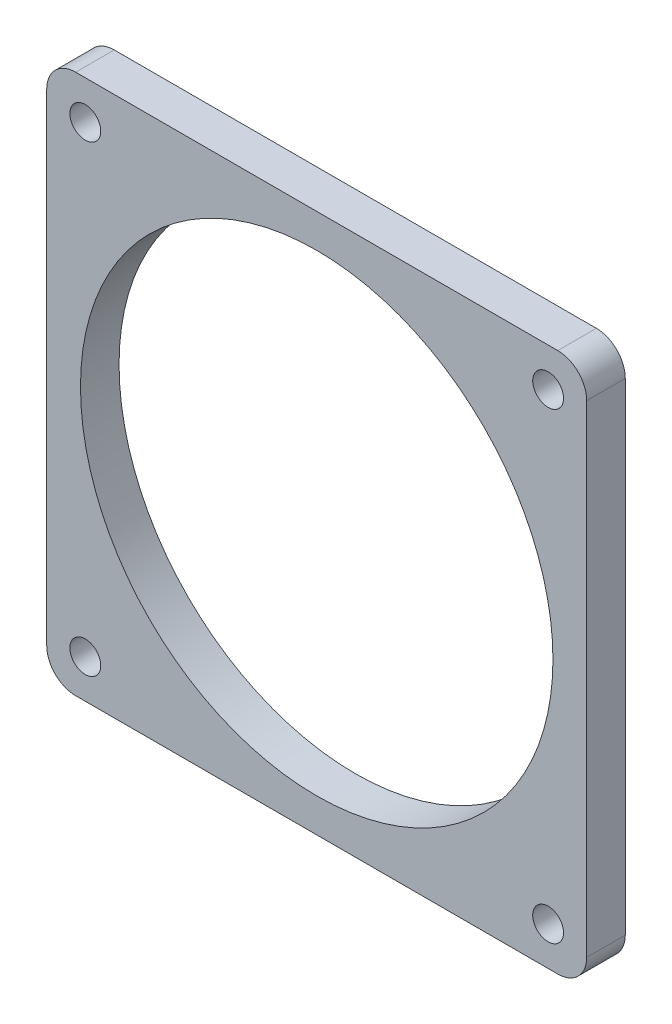
ISO-10303-21;
HEADER;
FILE_DESCRIPTION(('STEP AP214'),'2;1');
FILE_NAME('part.step','',(''),(''),'','','');
FILE_SCHEMA(('AUTOMOTIVE_DESIGN { 1 0 10303 214 1 1 1 1 }'));
ENDSEC;
DATA;
#1=APPLICATION_CONTEXT('core data for automotive mechanical design processes');
#2=APPLICATION_PROTOCOL_DEFINITION('international standard','automotive_design',2000,#1);
#3=PRODUCT_CONTEXT('',#1,'mechanical');
#4=PRODUCT('Part','Part','',(#3));
#5=PRODUCT_RELATED_PRODUCT_CATEGORY('part','',(#4));
#6=PRODUCT_DEFINITION_FORMATION('','',#4);
#7=PRODUCT_DEFINITION_CONTEXT('part definition',#1,'design');
#8=PRODUCT_DEFINITION('design','',#6,#7);
#9=PRODUCT_DEFINITION_SHAPE('','',#8);
#10=(LENGTH_UNIT() NAMED_UNIT(*) SI_UNIT(.MILLI.,.METRE.));
#11=(NAMED_UNIT(*) PLANE_ANGLE_UNIT() SI_UNIT($,.RADIAN.));
#12=(NAMED_UNIT(*) SI_UNIT($,.STERADIAN.) SOLID_ANGLE_UNIT());
#13=UNCERTAINTY_MEASURE_WITH_UNIT(LENGTH_MEASURE(1.E-05),#10,'distance_accuracy_value','');
#14=(GEOMETRIC_REPRESENTATION_CONTEXT(3) GLOBAL_UNCERTAINTY_ASSIGNED_CONTEXT((#13)) GLOBAL_UNIT_ASSIGNED_CONTEXT((#10,
#11,#12)) REPRESENTATION_CONTEXT('',''));
#15=CARTESIAN_POINT('',(0.,0.,0.));
#16=DIRECTION('',(0.,0.,1.));
#17=DIRECTION('',(1.,0.,0.));
#18=AXIS2_PLACEMENT_3D('',#15,#16,#17);
#19=CARTESIAN_POINT('',(28.,28.,-4.));
#20=DIRECTION('',(1.,0.,0.));
#21=DIRECTION('',(0.,1.,0.));
#22=AXIS2_PLACEMENT_3D('',#19,#20,#21);
#23=PLANE('',#22);
#24=DIRECTION('',(0.,1.,0.));
#25=VECTOR('',#24,1.);
#26=CARTESIAN_POINT('',(28.,28.,-4.));
#27=LINE('',#26,#25);
#28=CARTESIAN_POINT('',(28.,-25.,-4.));
#29=VERTEX_POINT('',#28);
#30=CARTESIAN_POINT('',(28.,25.,-4.));
#31=VERTEX_POINT('',#30);
#32=EDGE_CURVE('E163',#29,#31,#27,.T.);
#33=ORIENTED_EDGE('',*,*,#32,.T.);
#34=DIRECTION('',(0.,0.,1.));
#35=VECTOR('',#34,1.);
#36=CARTESIAN_POINT('',(28.,25.,-4.));
#37=LINE('',#36,#35);
#38=CARTESIAN_POINT('',(28.,25.,0.));
#39=VERTEX_POINT('',#38);
#40=EDGE_CURVE('E11',#31,#39,#37,.T.);
#41=ORIENTED_EDGE('',*,*,#40,.T.);
#42=DIRECTION('',(0.,1.,0.));
#43=VECTOR('',#42,1.);
#44=CARTESIAN_POINT('',(28.,28.,0.));
#45=LINE('',#44,#43);
#46=CARTESIAN_POINT('',(28.,-25.,0.));
#47=VERTEX_POINT('',#46);
#48=EDGE_CURVE('E113',#47,#39,#45,.T.);
#49=ORIENTED_EDGE('',*,*,#48,.F.);
#50=DIRECTION('',(0.,0.,1.));
#51=VECTOR('',#50,1.);
#52=CARTESIAN_POINT('',(28.,-25.,-4.));
#53=LINE('',#52,#51);
#54=EDGE_CURVE('E49',#47,#29,#53,.F.);
#55=ORIENTED_EDGE('',*,*,#54,.T.);
#56=EDGE_LOOP('',(#33,#41,#49,#55));
#57=FACE_BOUND('',#56,.T.);
#58=ADVANCED_FACE('F41',(#57),#23,.T.);
#59=CARTESIAN_POINT('',(-28.,-28.,-4.));
#60=DIRECTION('',(0.,-1.,0.));
#61=DIRECTION('',(0.,0.,-1.));
#62=AXIS2_PLACEMENT_3D('',#59,#60,#61);
#63=PLANE('',#62);
#64=DIRECTION('',(1.,0.,0.));
#65=VECTOR('',#64,1.);
#66=CARTESIAN_POINT('',(-28.,-28.,0.));
#67=LINE('',#66,#65);
#68=CARTESIAN_POINT('',(-25.,-28.,0.));
#69=VERTEX_POINT('',#68);
#70=CARTESIAN_POINT('',(25.,-28.,0.));
#71=VERTEX_POINT('',#70);
#72=EDGE_CURVE('E139',#69,#71,#67,.T.);
#73=ORIENTED_EDGE('',*,*,#72,.F.);
#74=DIRECTION('',(0.,0.,1.));
#75=VECTOR('',#74,1.);
#76=CARTESIAN_POINT('',(-25.,-28.,-4.));
#77=LINE('',#76,#75);
#78=CARTESIAN_POINT('',(-25.,-28.,-4.));
#79=VERTEX_POINT('',#78);
#80=EDGE_CURVE('E63',#69,#79,#77,.F.);
#81=ORIENTED_EDGE('',*,*,#80,.T.);
#82=DIRECTION('',(1.,0.,0.));
#83=VECTOR('',#82,1.);
#84=CARTESIAN_POINT('',(-28.,-28.,-4.));
#85=LINE('',#84,#83);
#86=CARTESIAN_POINT('',(25.,-28.,-4.));
#87=VERTEX_POINT('',#86);
#88=EDGE_CURVE('E133',#79,#87,#85,.T.);
#89=ORIENTED_EDGE('',*,*,#88,.T.);
#90=DIRECTION('',(0.,0.,1.));
#91=VECTOR('',#90,1.);
#92=CARTESIAN_POINT('',(25.,-28.,-4.));
#93=LINE('',#92,#91);
#94=EDGE_CURVE('E157',#87,#71,#93,.T.);
#95=ORIENTED_EDGE('',*,*,#94,.T.);
#96=EDGE_LOOP('',(#73,#81,#89,#95));
#97=FACE_BOUND('',#96,.T.);
#98=ADVANCED_FACE('F171',(#97),#63,.T.);
#99=CARTESIAN_POINT('',(-28.,28.,-4.));
#100=DIRECTION('',(-1.,0.,0.));
#101=DIRECTION('',(0.,-1.,0.));
#102=AXIS2_PLACEMENT_3D('',#99,#100,#101);
#103=PLANE('',#102);
#104=DIRECTION('',(0.,-1.,0.));
#105=VECTOR('',#104,1.);
#106=CARTESIAN_POINT('',(-28.,28.,0.));
#107=LINE('',#106,#105);
#108=CARTESIAN_POINT('',(-28.,25.,0.));
#109=VERTEX_POINT('',#108);
#110=CARTESIAN_POINT('',(-28.,-25.,0.));
#111=VERTEX_POINT('',#110);
#112=EDGE_CURVE('E128',#109,#111,#107,.T.);
#113=ORIENTED_EDGE('',*,*,#112,.F.);
#114=DIRECTION('',(0.,0.,1.));
#115=VECTOR('',#114,1.);
#116=CARTESIAN_POINT('',(-28.,25.,-4.));
#117=LINE('',#116,#115);
#118=CARTESIAN_POINT('',(-28.,25.,-4.));
#119=VERTEX_POINT('',#118);
#120=EDGE_CURVE('E149',#109,#119,#117,.F.);
#121=ORIENTED_EDGE('',*,*,#120,.T.);
#122=DIRECTION('',(0.,-1.,0.));
#123=VECTOR('',#122,1.);
#124=CARTESIAN_POINT('',(-28.,28.,-4.));
#125=LINE('',#124,#123);
#126=CARTESIAN_POINT('',(-28.,-25.,-4.));
#127=VERTEX_POINT('',#126);
#128=EDGE_CURVE('E136',#119,#127,#125,.T.);
#129=ORIENTED_EDGE('',*,*,#128,.T.);
#130=DIRECTION('',(0.,0.,1.));
#131=VECTOR('',#130,1.);
#132=CARTESIAN_POINT('',(-28.,-25.,-4.));
#133=LINE('',#132,#131);
#134=EDGE_CURVE('E146',#127,#111,#133,.T.);
#135=ORIENTED_EDGE('',*,*,#134,.T.);
#136=EDGE_LOOP('',(#113,#121,#129,#135));
#137=FACE_BOUND('',#136,.T.);
#138=ADVANCED_FACE('F239',(#137),#103,.T.);
#139=CARTESIAN_POINT('',(-28.,28.,-4.));
#140=DIRECTION('',(0.,1.,0.));
#141=DIRECTION('',(0.,0.,1.));
#142=AXIS2_PLACEMENT_3D('',#139,#140,#141);
#143=PLANE('',#142);
#144=DIRECTION('',(-1.,0.,0.));
#145=VECTOR('',#144,1.);
#146=CARTESIAN_POINT('',(-28.,28.,-4.));
#147=LINE('',#146,#145);
#148=CARTESIAN_POINT('',(25.,28.,-4.));
#149=VERTEX_POINT('',#148);
#150=CARTESIAN_POINT('',(-25.,28.,-4.));
#151=VERTEX_POINT('',#150);
#152=EDGE_CURVE('E167',#149,#151,#147,.T.);
#153=ORIENTED_EDGE('',*,*,#152,.T.);
#154=DIRECTION('',(0.,0.,1.));
#155=VECTOR('',#154,1.);
#156=CARTESIAN_POINT('',(-25.,28.,-4.));
#157=LINE('',#156,#155);
#158=CARTESIAN_POINT('',(-25.,28.,0.));
#159=VERTEX_POINT('',#158);
#160=EDGE_CURVE('E127',#151,#159,#157,.T.);
#161=ORIENTED_EDGE('',*,*,#160,.T.);
#162=DIRECTION('',(-1.,0.,0.));
#163=VECTOR('',#162,1.);
#164=CARTESIAN_POINT('',(-28.,28.,0.));
#165=LINE('',#164,#163);
#166=CARTESIAN_POINT('',(25.,28.,0.));
#167=VERTEX_POINT('',#166);
#168=EDGE_CURVE('E111',#167,#159,#165,.T.);
#169=ORIENTED_EDGE('',*,*,#168,.F.);
#170=DIRECTION('',(0.,0.,1.));
#171=VECTOR('',#170,1.);
#172=CARTESIAN_POINT('',(25.,28.,-4.));
#173=LINE('',#172,#171);
#174=EDGE_CURVE('E124',#167,#149,#173,.F.);
#175=ORIENTED_EDGE('',*,*,#174,.T.);
#176=EDGE_LOOP('',(#153,#161,#169,#175));
#177=FACE_BOUND('',#176,.T.);
#178=ADVANCED_FACE('F123',(#177),#143,.T.);
#179=CARTESIAN_POINT('',(0.,0.,-4.));
#180=DIRECTION('',(0.,0.,1.));
#181=DIRECTION('',(1.,0.,0.));
#182=AXIS2_PLACEMENT_3D('',#179,#180,#181);
#183=PLANE('',#182);
#184=CARTESIAN_POINT('',(-23.9999999999995,-24.,-4.));
#185=DIRECTION('',(0.,0.,1.));
#186=DIRECTION('',(1.,0.,0.));
#187=AXIS2_PLACEMENT_3D('',#184,#185,#186);
#188=CIRCLE('',#187,1.6);
#189=CARTESIAN_POINT('',(-22.3999999999995,-24.,-4.));
#190=VERTEX_POINT('',#189);
#191=EDGE_CURVE('E189',#190,#190,#188,.T.);
#192=ORIENTED_EDGE('',*,*,#191,.T.);
#193=EDGE_LOOP('',(#192));
#194=FACE_BOUND('',#193,.T.);
#195=CARTESIAN_POINT('',(24.0000000000005,-24.,-4.));
#196=DIRECTION('',(0.,0.,1.));
#197=DIRECTION('',(1.,0.,0.));
#198=AXIS2_PLACEMENT_3D('',#195,#196,#197);
#199=CIRCLE('',#198,1.6);
#200=CARTESIAN_POINT('',(25.6000000000005,-24.,-4.));
#201=VERTEX_POINT('',#200);
#202=EDGE_CURVE('E195',#201,#201,#199,.T.);
#203=ORIENTED_EDGE('',*,*,#202,.T.);
#204=EDGE_LOOP('',(#203));
#205=FACE_BOUND('',#204,.T.);
#206=CARTESIAN_POINT('',(24.,24.,-4.));
#207=DIRECTION('',(0.,0.,1.));
#208=DIRECTION('',(1.,0.,0.));
#209=AXIS2_PLACEMENT_3D('',#206,#207,#208);
#210=CIRCLE('',#209,1.6);
#211=CARTESIAN_POINT('',(25.6,24.,-4.));
#212=VERTEX_POINT('',#211);
#213=EDGE_CURVE('E201',#212,#212,#210,.T.);
#214=ORIENTED_EDGE('',*,*,#213,.T.);
#215=EDGE_LOOP('',(#214));
#216=FACE_BOUND('',#215,.T.);
#217=CARTESIAN_POINT('',(-24.,24.,-4.));
#218=DIRECTION('',(0.,0.,1.));
#219=DIRECTION('',(1.,0.,0.));
#220=AXIS2_PLACEMENT_3D('',#217,#218,#219);
#221=CIRCLE('',#220,1.6);
#222=CARTESIAN_POINT('',(-22.4,24.,-4.));
#223=VERTEX_POINT('',#222);
#224=EDGE_CURVE('E183',#223,#223,#221,.T.);
#225=ORIENTED_EDGE('',*,*,#224,.T.);
#226=EDGE_LOOP('',(#225));
#227=FACE_BOUND('',#226,.T.);
#228=CARTESIAN_POINT('',(0.,0.,-4.));
#229=DIRECTION('',(0.,0.,1.));
#230=DIRECTION('',(1.,0.,0.));
#231=AXIS2_PLACEMENT_3D('',#228,#229,#230);
#232=CIRCLE('',#231,24.5);
#233=CARTESIAN_POINT('',(24.5,0.,-4.));
#234=VERTEX_POINT('',#233);
#235=EDGE_CURVE('E175',#234,#234,#232,.T.);
#236=ORIENTED_EDGE('',*,*,#235,.T.);
#237=EDGE_LOOP('',(#236));
#238=FACE_BOUND('',#237,.T.);
#239=ORIENTED_EDGE('',*,*,#128,.F.);
#240=CARTESIAN_POINT('',(-25.,25.,-4.));
#241=DIRECTION('',(0.,0.,1.));
#242=DIRECTION('',(1.,0.,0.));
#243=AXIS2_PLACEMENT_3D('',#240,#241,#242);
#244=CIRCLE('',#243,3.);
#245=EDGE_CURVE('E155',#119,#151,#244,.F.);
#246=ORIENTED_EDGE('',*,*,#245,.T.);
#247=ORIENTED_EDGE('',*,*,#152,.F.);
#248=CARTESIAN_POINT('',(25.,25.,-4.));
#249=DIRECTION('',(0.,0.,1.));
#250=DIRECTION('',(1.,0.,0.));
#251=AXIS2_PLACEMENT_3D('',#248,#249,#250);
#252=CIRCLE('',#251,3.);
#253=EDGE_CURVE('E132',#149,#31,#252,.F.);
#254=ORIENTED_EDGE('',*,*,#253,.T.);
#255=ORIENTED_EDGE('',*,*,#32,.F.);
#256=CARTESIAN_POINT('',(25.,-25.,-4.));
#257=DIRECTION('',(0.,0.,1.));
#258=DIRECTION('',(1.,0.,0.));
#259=AXIS2_PLACEMENT_3D('',#256,#257,#258);
#260=CIRCLE('',#259,3.);
#261=EDGE_CURVE('E56',#29,#87,#260,.F.);
#262=ORIENTED_EDGE('',*,*,#261,.T.);
#263=ORIENTED_EDGE('',*,*,#88,.F.);
#264=CARTESIAN_POINT('',(-25.,-25.,-4.));
#265=DIRECTION('',(0.,0.,1.));
#266=DIRECTION('',(1.,0.,0.));
#267=AXIS2_PLACEMENT_3D('',#264,#265,#266);
#268=CIRCLE('',#267,3.);
#269=EDGE_CURVE('E153',#79,#127,#268,.F.);
#270=ORIENTED_EDGE('',*,*,#269,.T.);
#271=EDGE_LOOP('',(#239,#246,#247,#254,#255,#262,#263,#270));
#272=FACE_BOUND('',#271,.T.);
#273=ADVANCED_FACE('F166',(#194,#205,#216,#227,#238,#272),#183,.F.);
#274=CARTESIAN_POINT('',(0.,0.,0.));
#275=DIRECTION('',(0.,0.,1.));
#276=DIRECTION('',(1.,0.,0.));
#277=AXIS2_PLACEMENT_3D('',#274,#275,#276);
#278=PLANE('',#277);
#279=CARTESIAN_POINT('',(-23.9999999999995,-24.,0.));
#280=DIRECTION('',(0.,0.,1.));
#281=DIRECTION('',(1.,0.,0.));
#282=AXIS2_PLACEMENT_3D('',#279,#280,#281);
#283=CIRCLE('',#282,1.6);
#284=CARTESIAN_POINT('',(-22.3999999999995,-24.,0.));
#285=VERTEX_POINT('',#284);
#286=EDGE_CURVE('E186',#285,#285,#283,.T.);
#287=ORIENTED_EDGE('',*,*,#286,.F.);
#288=EDGE_LOOP('',(#287));
#289=FACE_BOUND('',#288,.T.);
#290=CARTESIAN_POINT('',(24.0000000000005,-24.,0.));
#291=DIRECTION('',(0.,0.,1.));
#292=DIRECTION('',(1.,0.,0.));
#293=AXIS2_PLACEMENT_3D('',#290,#291,#292);
#294=CIRCLE('',#293,1.6);
#295=CARTESIAN_POINT('',(25.6000000000005,-24.,0.));
#296=VERTEX_POINT('',#295);
#297=EDGE_CURVE('E192',#296,#296,#294,.T.);
#298=ORIENTED_EDGE('',*,*,#297,.F.);
#299=EDGE_LOOP('',(#298));
#300=FACE_BOUND('',#299,.T.);
#301=CARTESIAN_POINT('',(24.,24.,0.));
#302=DIRECTION('',(0.,0.,1.));
#303=DIRECTION('',(1.,0.,0.));
#304=AXIS2_PLACEMENT_3D('',#301,#302,#303);
#305=CIRCLE('',#304,1.6);
#306=CARTESIAN_POINT('',(25.6,24.,0.));
#307=VERTEX_POINT('',#306);
#308=EDGE_CURVE('E198',#307,#307,#305,.T.);
#309=ORIENTED_EDGE('',*,*,#308,.F.);
#310=EDGE_LOOP('',(#309));
#311=FACE_BOUND('',#310,.T.);
#312=CARTESIAN_POINT('',(-24.,24.,0.));
#313=DIRECTION('',(0.,0.,1.));
#314=DIRECTION('',(1.,0.,0.));
#315=AXIS2_PLACEMENT_3D('',#312,#313,#314);
#316=CIRCLE('',#315,1.6);
#317=CARTESIAN_POINT('',(-22.4,24.,0.));
#318=VERTEX_POINT('',#317);
#319=EDGE_CURVE('E204',#318,#318,#316,.T.);
#320=ORIENTED_EDGE('',*,*,#319,.F.);
#321=EDGE_LOOP('',(#320));
#322=FACE_BOUND('',#321,.T.);
#323=CARTESIAN_POINT('',(0.,0.,0.));
#324=DIRECTION('',(0.,0.,1.));
#325=DIRECTION('',(1.,0.,0.));
#326=AXIS2_PLACEMENT_3D('',#323,#324,#325);
#327=CIRCLE('',#326,24.5);
#328=CARTESIAN_POINT('',(24.5,0.,0.));
#329=VERTEX_POINT('',#328);
#330=EDGE_CURVE('E180',#329,#329,#327,.T.);
#331=ORIENTED_EDGE('',*,*,#330,.F.);
#332=EDGE_LOOP('',(#331));
#333=FACE_BOUND('',#332,.T.);
#334=ORIENTED_EDGE('',*,*,#168,.T.);
#335=CARTESIAN_POINT('',(-25.,25.,0.));
#336=DIRECTION('',(0.,0.,1.));
#337=DIRECTION('',(1.,0.,0.));
#338=AXIS2_PLACEMENT_3D('',#335,#336,#337);
#339=CIRCLE('',#338,3.);
#340=EDGE_CURVE('E144',#159,#109,#339,.T.);
#341=ORIENTED_EDGE('',*,*,#340,.T.);
#342=ORIENTED_EDGE('',*,*,#112,.T.);
#343=CARTESIAN_POINT('',(-25.,-25.,0.));
#344=DIRECTION('',(0.,0.,1.));
#345=DIRECTION('',(1.,0.,0.));
#346=AXIS2_PLACEMENT_3D('',#343,#344,#345);
#347=CIRCLE('',#346,3.);
#348=EDGE_CURVE('E117',#111,#69,#347,.T.);
#349=ORIENTED_EDGE('',*,*,#348,.T.);
#350=ORIENTED_EDGE('',*,*,#72,.T.);
#351=CARTESIAN_POINT('',(25.,-25.,0.));
#352=DIRECTION('',(0.,0.,1.));
#353=DIRECTION('',(1.,0.,0.));
#354=AXIS2_PLACEMENT_3D('',#351,#352,#353);
#355=CIRCLE('',#354,3.);
#356=EDGE_CURVE('E118',#71,#47,#355,.T.);
#357=ORIENTED_EDGE('',*,*,#356,.T.);
#358=ORIENTED_EDGE('',*,*,#48,.T.);
#359=CARTESIAN_POINT('',(25.,25.,0.));
#360=DIRECTION('',(0.,0.,1.));
#361=DIRECTION('',(1.,0.,0.));
#362=AXIS2_PLACEMENT_3D('',#359,#360,#361);
#363=CIRCLE('',#362,3.);
#364=EDGE_CURVE('E108',#39,#167,#363,.T.);
#365=ORIENTED_EDGE('',*,*,#364,.T.);
#366=EDGE_LOOP('',(#334,#341,#342,#349,#350,#357,#358,#365));
#367=FACE_BOUND('',#366,.T.);
#368=ADVANCED_FACE('F110',(#289,#300,#311,#322,#333,#367),#278,.T.);
#369=CARTESIAN_POINT('',(0.,0.,-4.));
#370=DIRECTION('',(0.,0.,1.));
#371=DIRECTION('',(1.,0.,0.));
#372=AXIS2_PLACEMENT_3D('',#369,#370,#371);
#373=CYLINDRICAL_SURFACE('',#372,24.5);
#374=ORIENTED_EDGE('',*,*,#235,.F.);
#375=EDGE_LOOP('',(#374));
#376=FACE_BOUND('',#375,.T.);
#377=ORIENTED_EDGE('',*,*,#330,.T.);
#378=EDGE_LOOP('',(#377));
#379=FACE_BOUND('',#378,.T.);
#380=ADVANCED_FACE('F216',(#376,#379),#373,.F.);
#381=CARTESIAN_POINT('',(-24.,24.,-4.));
#382=DIRECTION('',(0.,0.,1.));
#383=DIRECTION('',(1.,0.,0.));
#384=AXIS2_PLACEMENT_3D('',#381,#382,#383);
#385=CYLINDRICAL_SURFACE('',#384,1.6);
#386=ORIENTED_EDGE('',*,*,#224,.F.);
#387=EDGE_LOOP('',(#386));
#388=FACE_BOUND('',#387,.T.);
#389=ORIENTED_EDGE('',*,*,#319,.T.);
#390=EDGE_LOOP('',(#389));
#391=FACE_BOUND('',#390,.T.);
#392=ADVANCED_FACE('F212',(#388,#391),#385,.F.);
#393=CARTESIAN_POINT('',(24.,24.,-4.));
#394=DIRECTION('',(0.,0.,1.));
#395=DIRECTION('',(1.,0.,0.));
#396=AXIS2_PLACEMENT_3D('',#393,#394,#395);
#397=CYLINDRICAL_SURFACE('',#396,1.6);
#398=ORIENTED_EDGE('',*,*,#213,.F.);
#399=EDGE_LOOP('',(#398));
#400=FACE_BOUND('',#399,.T.);
#401=ORIENTED_EDGE('',*,*,#308,.T.);
#402=EDGE_LOOP('',(#401));
#403=FACE_BOUND('',#402,.T.);
#404=ADVANCED_FACE('F215',(#400,#403),#397,.F.);
#405=CARTESIAN_POINT('',(24.0000000000005,-24.,-4.));
#406=DIRECTION('',(0.,0.,1.));
#407=DIRECTION('',(1.,0.,0.));
#408=AXIS2_PLACEMENT_3D('',#405,#406,#407);
#409=CYLINDRICAL_SURFACE('',#408,1.6);
#410=ORIENTED_EDGE('',*,*,#202,.F.);
#411=EDGE_LOOP('',(#410));
#412=FACE_BOUND('',#411,.T.);
#413=ORIENTED_EDGE('',*,*,#297,.T.);
#414=EDGE_LOOP('',(#413));
#415=FACE_BOUND('',#414,.T.);
#416=ADVANCED_FACE('F333',(#412,#415),#409,.F.);
#417=CARTESIAN_POINT('',(-23.9999999999995,-24.,-4.));
#418=DIRECTION('',(0.,0.,1.));
#419=DIRECTION('',(1.,0.,0.));
#420=AXIS2_PLACEMENT_3D('',#417,#418,#419);
#421=CYLINDRICAL_SURFACE('',#420,1.6);
#422=ORIENTED_EDGE('',*,*,#191,.F.);
#423=EDGE_LOOP('',(#422));
#424=FACE_BOUND('',#423,.T.);
#425=ORIENTED_EDGE('',*,*,#286,.T.);
#426=EDGE_LOOP('',(#425));
#427=FACE_BOUND('',#426,.T.);
#428=ADVANCED_FACE('F248',(#424,#427),#421,.F.);
#429=CARTESIAN_POINT('',(-25.,25.,-4.));
#430=DIRECTION('',(0.,0.,1.));
#431=DIRECTION('',(1.,0.,0.));
#432=AXIS2_PLACEMENT_3D('',#429,#430,#431);
#433=CYLINDRICAL_SURFACE('',#432,3.);
#434=ORIENTED_EDGE('',*,*,#245,.F.);
#435=ORIENTED_EDGE('',*,*,#120,.F.);
#436=ORIENTED_EDGE('',*,*,#340,.F.);
#437=ORIENTED_EDGE('',*,*,#160,.F.);
#438=EDGE_LOOP('',(#434,#435,#436,#437));
#439=FACE_BOUND('',#438,.T.);
#440=ADVANCED_FACE('F244',(#439),#433,.T.);
#441=CARTESIAN_POINT('',(-25.,-25.,-4.));
#442=DIRECTION('',(0.,0.,1.));
#443=DIRECTION('',(1.,0.,0.));
#444=AXIS2_PLACEMENT_3D('',#441,#442,#443);
#445=CYLINDRICAL_SURFACE('',#444,3.);
#446=ORIENTED_EDGE('',*,*,#269,.F.);
#447=ORIENTED_EDGE('',*,*,#80,.F.);
#448=ORIENTED_EDGE('',*,*,#348,.F.);
#449=ORIENTED_EDGE('',*,*,#134,.F.);
#450=EDGE_LOOP('',(#446,#447,#448,#449));
#451=FACE_BOUND('',#450,.T.);
#452=ADVANCED_FACE('F247',(#451),#445,.T.);
#453=CARTESIAN_POINT('',(25.,25.,-4.));
#454=DIRECTION('',(0.,0.,1.));
#455=DIRECTION('',(1.,0.,0.));
#456=AXIS2_PLACEMENT_3D('',#453,#454,#455);
#457=CYLINDRICAL_SURFACE('',#456,3.);
#458=ORIENTED_EDGE('',*,*,#253,.F.);
#459=ORIENTED_EDGE('',*,*,#174,.F.);
#460=ORIENTED_EDGE('',*,*,#364,.F.);
#461=ORIENTED_EDGE('',*,*,#40,.F.);
#462=EDGE_LOOP('',(#458,#459,#460,#461));
#463=FACE_BOUND('',#462,.T.);
#464=ADVANCED_FACE('F131',(#463),#457,.T.);
#465=CARTESIAN_POINT('',(25.,-25.,-4.));
#466=DIRECTION('',(0.,0.,1.));
#467=DIRECTION('',(1.,0.,0.));
#468=AXIS2_PLACEMENT_3D('',#465,#466,#467);
#469=CYLINDRICAL_SURFACE('',#468,3.);
#470=ORIENTED_EDGE('',*,*,#261,.F.);
#471=ORIENTED_EDGE('',*,*,#54,.F.);
#472=ORIENTED_EDGE('',*,*,#356,.F.);
#473=ORIENTED_EDGE('',*,*,#94,.F.);
#474=EDGE_LOOP('',(#470,#471,#472,#473));
#475=FACE_BOUND('',#474,.T.);
#476=ADVANCED_FACE('F43',(#475),#469,.T.);
#477=CLOSED_SHELL('',(#58,#98,#138,#178,#273,#368,#380,#392,#404,#416,#428,#440,#452,#464,#476));
#478=MANIFOLD_SOLID_BREP('B2',#477);
#479=ADVANCED_BREP_SHAPE_REPRESENTATION('',(#18,#478),#14);
#480=SHAPE_DEFINITION_REPRESENTATION(#9,#479);
ENDSEC;
END-ISO-10303-21;
